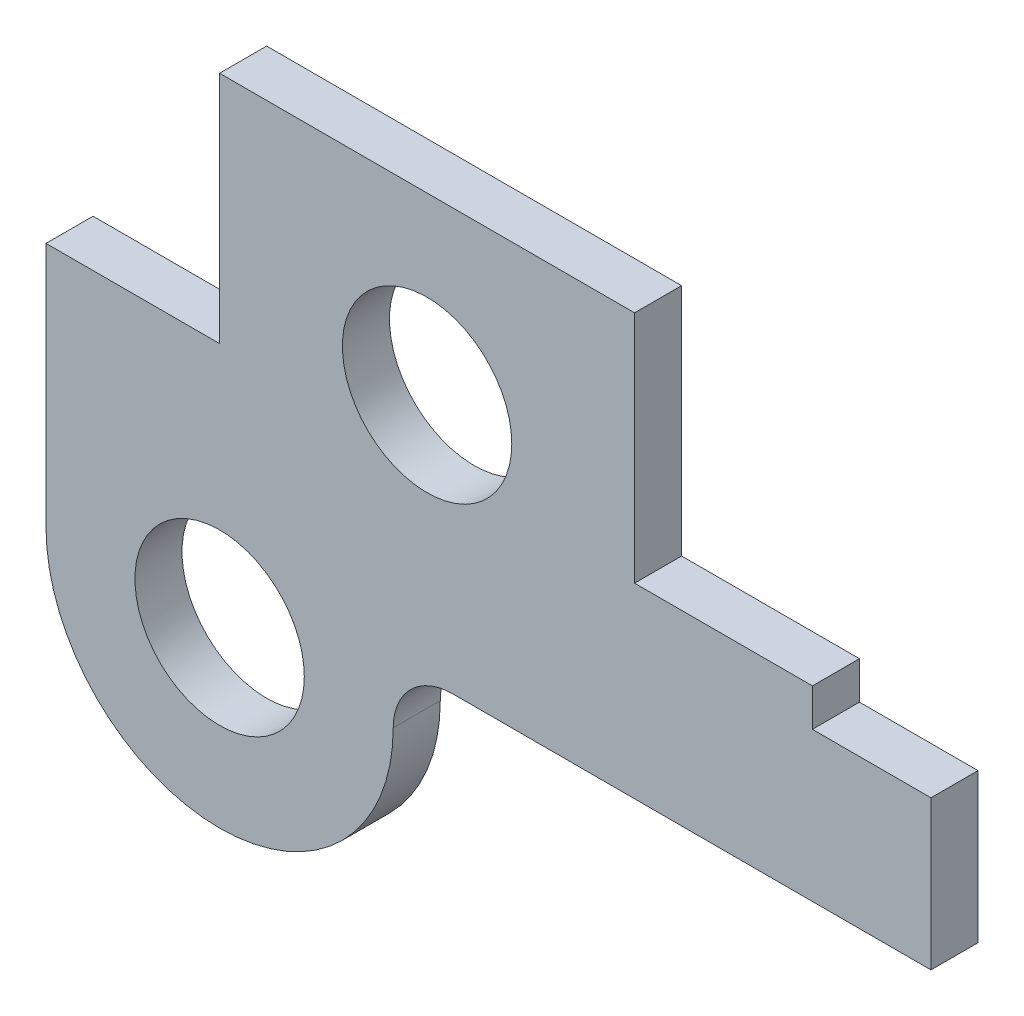
ISO-10303-21;
HEADER;
FILE_DESCRIPTION(('STEP AP214'),'2;1');
FILE_NAME('part.step','',(''),(''),'','','');
FILE_SCHEMA(('AUTOMOTIVE_DESIGN { 1 0 10303 214 1 1 1 1 }'));
ENDSEC;
DATA;
#1=APPLICATION_CONTEXT('core data for automotive mechanical design processes');
#2=APPLICATION_PROTOCOL_DEFINITION('international standard','automotive_design',2000,#1);
#3=PRODUCT_CONTEXT('',#1,'mechanical');
#4=PRODUCT('Part','Part','',(#3));
#5=PRODUCT_RELATED_PRODUCT_CATEGORY('part','',(#4));
#6=PRODUCT_DEFINITION_FORMATION('','',#4);
#7=PRODUCT_DEFINITION_CONTEXT('part definition',#1,'design');
#8=PRODUCT_DEFINITION('design','',#6,#7);
#9=PRODUCT_DEFINITION_SHAPE('','',#8);
#10=(LENGTH_UNIT() NAMED_UNIT(*) SI_UNIT(.MILLI.,.METRE.));
#11=(NAMED_UNIT(*) PLANE_ANGLE_UNIT() SI_UNIT($,.RADIAN.));
#12=(NAMED_UNIT(*) SI_UNIT($,.STERADIAN.) SOLID_ANGLE_UNIT());
#13=UNCERTAINTY_MEASURE_WITH_UNIT(LENGTH_MEASURE(1.E-05),#10,'distance_accuracy_value','');
#14=(GEOMETRIC_REPRESENTATION_CONTEXT(3) GLOBAL_UNCERTAINTY_ASSIGNED_CONTEXT((#13)) GLOBAL_UNIT_ASSIGNED_CONTEXT((#10,
#11,#12)) REPRESENTATION_CONTEXT('',''));
#15=CARTESIAN_POINT('',(0.,0.,0.));
#16=DIRECTION('',(0.,0.,1.));
#17=DIRECTION('',(1.,0.,0.));
#18=AXIS2_PLACEMENT_3D('',#15,#16,#17);
#19=CARTESIAN_POINT('',(68.575,29.2875,7.9375));
#20=DIRECTION('',(0.,0.,1.));
#21=DIRECTION('',(1.,0.,0.));
#22=AXIS2_PLACEMENT_3D('',#19,#20,#21);
#23=PLANE('',#22);
#24=CARTESIAN_POINT('',(64.2875,80.7875,7.9375));
#25=DIRECTION('',(0.,0.,1.));
#26=DIRECTION('',(1.,0.,0.));
#27=AXIS2_PLACEMENT_3D('',#24,#25,#26);
#28=CIRCLE('',#27,14.2875);
#29=CARTESIAN_POINT('',(78.575,80.7875,7.9375));
#30=VERTEX_POINT('',#29);
#31=EDGE_CURVE('E158',#30,#30,#28,.T.);
#32=ORIENTED_EDGE('',*,*,#31,.F.);
#33=EDGE_LOOP('',(#32));
#34=FACE_BOUND('',#33,.T.);
#35=CARTESIAN_POINT('',(68.575,29.2875,7.9375));
#36=DIRECTION('',(0.,0.,-1.));
#37=DIRECTION('',(1.,0.,0.));
#38=AXIS2_PLACEMENT_3D('',#35,#36,#37);
#39=CIRCLE('',#38,10.);
#40=CARTESIAN_POINT('',(58.575,29.2875,7.9375));
#41=VERTEX_POINT('',#40);
#42=CARTESIAN_POINT('',(68.575,39.2875,7.9375));
#43=VERTEX_POINT('',#42);
#44=EDGE_CURVE('E177',#41,#43,#39,.T.);
#45=ORIENTED_EDGE('',*,*,#44,.T.);
#46=DIRECTION('',(1.,0.,0.));
#47=VECTOR('',#46,1.);
#48=CARTESIAN_POINT('',(68.575,39.2875,7.9375));
#49=LINE('',#48,#47);
#50=CARTESIAN_POINT('',(149.2875,39.2875,7.9375));
#51=VERTEX_POINT('',#50);
#52=EDGE_CURVE('E105',#43,#51,#49,.T.);
#53=ORIENTED_EDGE('',*,*,#52,.T.);
#54=DIRECTION('',(0.,1.,0.));
#55=VECTOR('',#54,1.);
#56=CARTESIAN_POINT('',(149.2875,39.2875,7.9375));
#57=LINE('',#56,#55);
#58=CARTESIAN_POINT('',(149.2875,64.4375,7.9375));
#59=VERTEX_POINT('',#58);
#60=EDGE_CURVE('E204',#51,#59,#57,.T.);
#61=ORIENTED_EDGE('',*,*,#60,.T.);
#62=DIRECTION('',(-1.,0.,0.));
#63=VECTOR('',#62,1.);
#64=CARTESIAN_POINT('',(149.2875,64.4375,7.9375));
#65=LINE('',#64,#63);
#66=CARTESIAN_POINT('',(129.2875,64.4375,7.9375));
#67=VERTEX_POINT('',#66);
#68=EDGE_CURVE('E223',#59,#67,#65,.T.);
#69=ORIENTED_EDGE('',*,*,#68,.T.);
#70=DIRECTION('',(0.,1.,0.));
#71=VECTOR('',#70,1.);
#72=CARTESIAN_POINT('',(129.2875,64.4375,7.9375));
#73=LINE('',#72,#71);
#74=CARTESIAN_POINT('',(129.2875,70.7875,7.9375));
#75=VERTEX_POINT('',#74);
#76=EDGE_CURVE('E220',#67,#75,#73,.T.);
#77=ORIENTED_EDGE('',*,*,#76,.T.);
#78=DIRECTION('',(-1.,0.,0.));
#79=VECTOR('',#78,1.);
#80=CARTESIAN_POINT('',(129.2875,70.7875,7.9375));
#81=LINE('',#80,#79);
#82=CARTESIAN_POINT('',(99.2875,70.7875,7.9375));
#83=VERTEX_POINT('',#82);
#84=EDGE_CURVE('E222',#75,#83,#81,.T.);
#85=ORIENTED_EDGE('',*,*,#84,.T.);
#86=DIRECTION('',(0.,1.,0.));
#87=VECTOR('',#86,1.);
#88=CARTESIAN_POINT('',(99.2875,70.7875,7.9375));
#89=LINE('',#88,#87);
#90=CARTESIAN_POINT('',(99.2875,110.2875,7.9375));
#91=VERTEX_POINT('',#90);
#92=EDGE_CURVE('E225',#83,#91,#89,.T.);
#93=ORIENTED_EDGE('',*,*,#92,.T.);
#94=DIRECTION('',(-1.,0.,0.));
#95=VECTOR('',#94,1.);
#96=CARTESIAN_POINT('',(99.2875,110.2875,7.9375));
#97=LINE('',#96,#95);
#98=CARTESIAN_POINT('',(29.2875,110.2875,7.9375));
#99=VERTEX_POINT('',#98);
#100=EDGE_CURVE('E231',#91,#99,#97,.T.);
#101=ORIENTED_EDGE('',*,*,#100,.T.);
#102=DIRECTION('',(0.,-1.,0.));
#103=VECTOR('',#102,1.);
#104=CARTESIAN_POINT('',(29.2875,70.7875,7.9375));
#105=LINE('',#104,#103);
#106=CARTESIAN_POINT('',(29.2875,70.7875,7.9375));
#107=VERTEX_POINT('',#106);
#108=EDGE_CURVE('E136',#99,#107,#105,.T.);
#109=ORIENTED_EDGE('',*,*,#108,.T.);
#110=DIRECTION('',(-1.,0.,0.));
#111=VECTOR('',#110,1.);
#112=CARTESIAN_POINT('',(0.,70.7875,7.9375));
#113=LINE('',#112,#111);
#114=CARTESIAN_POINT('',(0.,70.7875,7.9375));
#115=VERTEX_POINT('',#114);
#116=EDGE_CURVE('E130',#107,#115,#113,.T.);
#117=ORIENTED_EDGE('',*,*,#116,.T.);
#118=DIRECTION('',(0.,-1.,0.));
#119=VECTOR('',#118,1.);
#120=CARTESIAN_POINT('',(0.,29.2875,7.9375));
#121=LINE('',#120,#119);
#122=CARTESIAN_POINT('',(0.,29.2875,7.9375));
#123=VERTEX_POINT('',#122);
#124=EDGE_CURVE('E134',#115,#123,#121,.T.);
#125=ORIENTED_EDGE('',*,*,#124,.T.);
#126=CARTESIAN_POINT('',(29.2875,29.2875,7.9375));
#127=DIRECTION('',(0.,0.,1.));
#128=DIRECTION('',(1.,0.,0.));
#129=AXIS2_PLACEMENT_3D('',#126,#127,#128);
#130=CIRCLE('',#129,29.2875);
#131=EDGE_CURVE('E50',#123,#41,#130,.T.);
#132=ORIENTED_EDGE('',*,*,#131,.T.);
#133=EDGE_LOOP('',(#45,#53,#61,#69,#77,#85,#93,#101,#109,#117,#125,#132));
#134=FACE_BOUND('',#133,.T.);
#135=CARTESIAN_POINT('',(29.2875,29.2875,7.9375));
#136=DIRECTION('',(0.,0.,1.));
#137=DIRECTION('',(1.,0.,0.));
#138=AXIS2_PLACEMENT_3D('',#135,#136,#137);
#139=CIRCLE('',#138,14.2875);
#140=CARTESIAN_POINT('',(43.575,29.2875,7.9375));
#141=VERTEX_POINT('',#140);
#142=EDGE_CURVE('E273',#141,#141,#139,.T.);
#143=ORIENTED_EDGE('',*,*,#142,.F.);
#144=EDGE_LOOP('',(#143));
#145=FACE_BOUND('',#144,.T.);
#146=ADVANCED_FACE('F33',(#34,#134,#145),#23,.T.);
#147=CARTESIAN_POINT('',(68.575,29.2875,0.));
#148=DIRECTION('',(0.,0.,1.));
#149=DIRECTION('',(1.,0.,0.));
#150=AXIS2_PLACEMENT_3D('',#147,#148,#149);
#151=PLANE('',#150);
#152=CARTESIAN_POINT('',(68.575,29.2875,0.));
#153=DIRECTION('',(0.,0.,-1.));
#154=DIRECTION('',(1.,0.,0.));
#155=AXIS2_PLACEMENT_3D('',#152,#153,#154);
#156=CIRCLE('',#155,10.);
#157=CARTESIAN_POINT('',(58.575,29.2875,0.));
#158=VERTEX_POINT('',#157);
#159=CARTESIAN_POINT('',(68.575,39.2875,0.));
#160=VERTEX_POINT('',#159);
#161=EDGE_CURVE('E154',#158,#160,#156,.T.);
#162=ORIENTED_EDGE('',*,*,#161,.F.);
#163=CARTESIAN_POINT('',(29.2875,29.2875,0.));
#164=DIRECTION('',(0.,0.,1.));
#165=DIRECTION('',(1.,0.,0.));
#166=AXIS2_PLACEMENT_3D('',#163,#164,#165);
#167=CIRCLE('',#166,29.2875);
#168=CARTESIAN_POINT('',(0.,29.2875,0.));
#169=VERTEX_POINT('',#168);
#170=EDGE_CURVE('E97',#169,#158,#167,.T.);
#171=ORIENTED_EDGE('',*,*,#170,.F.);
#172=DIRECTION('',(0.,-1.,0.));
#173=VECTOR('',#172,1.);
#174=CARTESIAN_POINT('',(0.,29.2875,0.));
#175=LINE('',#174,#173);
#176=CARTESIAN_POINT('',(0.,70.7875,0.));
#177=VERTEX_POINT('',#176);
#178=EDGE_CURVE('E91',#177,#169,#175,.T.);
#179=ORIENTED_EDGE('',*,*,#178,.F.);
#180=DIRECTION('',(-1.,0.,0.));
#181=VECTOR('',#180,1.);
#182=CARTESIAN_POINT('',(0.,70.7875,0.));
#183=LINE('',#182,#181);
#184=CARTESIAN_POINT('',(29.2875,70.7875,0.));
#185=VERTEX_POINT('',#184);
#186=EDGE_CURVE('E144',#185,#177,#183,.T.);
#187=ORIENTED_EDGE('',*,*,#186,.F.);
#188=DIRECTION('',(0.,-1.,0.));
#189=VECTOR('',#188,1.);
#190=CARTESIAN_POINT('',(29.2875,70.7875,0.));
#191=LINE('',#190,#189);
#192=CARTESIAN_POINT('',(29.2875,110.2875,0.));
#193=VERTEX_POINT('',#192);
#194=EDGE_CURVE('E172',#193,#185,#191,.T.);
#195=ORIENTED_EDGE('',*,*,#194,.F.);
#196=DIRECTION('',(-1.,0.,0.));
#197=VECTOR('',#196,1.);
#198=CARTESIAN_POINT('',(99.2875,110.2875,0.));
#199=LINE('',#198,#197);
#200=CARTESIAN_POINT('',(99.2875,110.2875,0.));
#201=VERTEX_POINT('',#200);
#202=EDGE_CURVE('E170',#201,#193,#199,.T.);
#203=ORIENTED_EDGE('',*,*,#202,.F.);
#204=DIRECTION('',(0.,1.,0.));
#205=VECTOR('',#204,1.);
#206=CARTESIAN_POINT('',(99.2875,70.7875,0.));
#207=LINE('',#206,#205);
#208=CARTESIAN_POINT('',(99.2875,70.7875,0.));
#209=VERTEX_POINT('',#208);
#210=EDGE_CURVE('E168',#209,#201,#207,.T.);
#211=ORIENTED_EDGE('',*,*,#210,.F.);
#212=DIRECTION('',(-1.,0.,0.));
#213=VECTOR('',#212,1.);
#214=CARTESIAN_POINT('',(129.2875,70.7875,0.));
#215=LINE('',#214,#213);
#216=CARTESIAN_POINT('',(129.2875,70.7875,0.));
#217=VERTEX_POINT('',#216);
#218=EDGE_CURVE('E166',#217,#209,#215,.T.);
#219=ORIENTED_EDGE('',*,*,#218,.F.);
#220=DIRECTION('',(0.,1.,0.));
#221=VECTOR('',#220,1.);
#222=CARTESIAN_POINT('',(129.2875,64.4375,0.));
#223=LINE('',#222,#221);
#224=CARTESIAN_POINT('',(129.2875,64.4375,0.));
#225=VERTEX_POINT('',#224);
#226=EDGE_CURVE('E164',#225,#217,#223,.T.);
#227=ORIENTED_EDGE('',*,*,#226,.F.);
#228=DIRECTION('',(-1.,0.,0.));
#229=VECTOR('',#228,1.);
#230=CARTESIAN_POINT('',(149.2875,64.4375,0.));
#231=LINE('',#230,#229);
#232=CARTESIAN_POINT('',(149.2875,64.4375,0.));
#233=VERTEX_POINT('',#232);
#234=EDGE_CURVE('E162',#233,#225,#231,.T.);
#235=ORIENTED_EDGE('',*,*,#234,.F.);
#236=DIRECTION('',(0.,1.,0.));
#237=VECTOR('',#236,1.);
#238=CARTESIAN_POINT('',(149.2875,39.2875,0.));
#239=LINE('',#238,#237);
#240=CARTESIAN_POINT('',(149.2875,39.2875,0.));
#241=VERTEX_POINT('',#240);
#242=EDGE_CURVE('E160',#241,#233,#239,.T.);
#243=ORIENTED_EDGE('',*,*,#242,.F.);
#244=DIRECTION('',(1.,0.,0.));
#245=VECTOR('',#244,1.);
#246=CARTESIAN_POINT('',(68.575,39.2875,0.));
#247=LINE('',#246,#245);
#248=EDGE_CURVE('E157',#160,#241,#247,.T.);
#249=ORIENTED_EDGE('',*,*,#248,.F.);
#250=EDGE_LOOP('',(#162,#171,#179,#187,#195,#203,#211,#219,#227,#235,#243,#249));
#251=FACE_BOUND('',#250,.T.);
#252=CARTESIAN_POINT('',(64.2875,80.7875,0.));
#253=DIRECTION('',(0.,0.,1.));
#254=DIRECTION('',(1.,0.,0.));
#255=AXIS2_PLACEMENT_3D('',#252,#253,#254);
#256=CIRCLE('',#255,14.2875);
#257=CARTESIAN_POINT('',(78.575,80.7875,0.));
#258=VERTEX_POINT('',#257);
#259=EDGE_CURVE('E279',#258,#258,#256,.T.);
#260=ORIENTED_EDGE('',*,*,#259,.T.);
#261=EDGE_LOOP('',(#260));
#262=FACE_BOUND('',#261,.T.);
#263=CARTESIAN_POINT('',(29.2875,29.2875,0.));
#264=DIRECTION('',(0.,0.,1.));
#265=DIRECTION('',(1.,0.,0.));
#266=AXIS2_PLACEMENT_3D('',#263,#264,#265);
#267=CIRCLE('',#266,14.2875);
#268=CARTESIAN_POINT('',(43.575,29.2875,0.));
#269=VERTEX_POINT('',#268);
#270=EDGE_CURVE('E276',#269,#269,#267,.T.);
#271=ORIENTED_EDGE('',*,*,#270,.T.);
#272=EDGE_LOOP('',(#271));
#273=FACE_BOUND('',#272,.T.);
#274=ADVANCED_FACE('F208',(#251,#262,#273),#151,.F.);
#275=CARTESIAN_POINT('',(68.575,29.2875,7.9375));
#276=DIRECTION('',(0.,0.,-1.));
#277=DIRECTION('',(-1.,0.,0.));
#278=AXIS2_PLACEMENT_3D('',#275,#276,#277);
#279=CYLINDRICAL_SURFACE('',#278,10.);
#280=ORIENTED_EDGE('',*,*,#161,.T.);
#281=DIRECTION('',(0.,0.,-1.));
#282=VECTOR('',#281,1.);
#283=CARTESIAN_POINT('',(68.575,39.2875,7.9375));
#284=LINE('',#283,#282);
#285=EDGE_CURVE('E11',#43,#160,#284,.T.);
#286=ORIENTED_EDGE('',*,*,#285,.F.);
#287=ORIENTED_EDGE('',*,*,#44,.F.);
#288=DIRECTION('',(0.,0.,-1.));
#289=VECTOR('',#288,1.);
#290=CARTESIAN_POINT('',(58.575,29.2875,7.9375));
#291=LINE('',#290,#289);
#292=EDGE_CURVE('E150',#41,#158,#291,.T.);
#293=ORIENTED_EDGE('',*,*,#292,.T.);
#294=EDGE_LOOP('',(#280,#286,#287,#293));
#295=FACE_BOUND('',#294,.T.);
#296=ADVANCED_FACE('F35',(#295),#279,.F.);
#297=CARTESIAN_POINT('',(68.575,39.2875,7.9375));
#298=DIRECTION('',(0.,1.,0.));
#299=DIRECTION('',(0.,0.,1.));
#300=AXIS2_PLACEMENT_3D('',#297,#298,#299);
#301=PLANE('',#300);
#302=ORIENTED_EDGE('',*,*,#248,.T.);
#303=DIRECTION('',(0.,0.,-1.));
#304=VECTOR('',#303,1.);
#305=CARTESIAN_POINT('',(149.2875,39.2875,7.9375));
#306=LINE('',#305,#304);
#307=EDGE_CURVE('E42',#51,#241,#306,.T.);
#308=ORIENTED_EDGE('',*,*,#307,.F.);
#309=ORIENTED_EDGE('',*,*,#52,.F.);
#310=ORIENTED_EDGE('',*,*,#285,.T.);
#311=EDGE_LOOP('',(#302,#308,#309,#310));
#312=FACE_BOUND('',#311,.T.);
#313=ADVANCED_FACE('F372',(#312),#301,.F.);
#314=CARTESIAN_POINT('',(149.2875,39.2875,7.9375));
#315=DIRECTION('',(-1.,0.,0.));
#316=DIRECTION('',(0.,0.,1.));
#317=AXIS2_PLACEMENT_3D('',#314,#315,#316);
#318=PLANE('',#317);
#319=ORIENTED_EDGE('',*,*,#242,.T.);
#320=DIRECTION('',(0.,0.,-1.));
#321=VECTOR('',#320,1.);
#322=CARTESIAN_POINT('',(149.2875,64.4375,7.9375));
#323=LINE('',#322,#321);
#324=EDGE_CURVE('E196',#59,#233,#323,.T.);
#325=ORIENTED_EDGE('',*,*,#324,.F.);
#326=ORIENTED_EDGE('',*,*,#60,.F.);
#327=ORIENTED_EDGE('',*,*,#307,.T.);
#328=EDGE_LOOP('',(#319,#325,#326,#327));
#329=FACE_BOUND('',#328,.T.);
#330=ADVANCED_FACE('F202',(#329),#318,.F.);
#331=CARTESIAN_POINT('',(149.2875,64.4375,7.9375));
#332=DIRECTION('',(0.,-1.,0.));
#333=DIRECTION('',(1.,0.,0.));
#334=AXIS2_PLACEMENT_3D('',#331,#332,#333);
#335=PLANE('',#334);
#336=ORIENTED_EDGE('',*,*,#234,.T.);
#337=DIRECTION('',(0.,0.,-1.));
#338=VECTOR('',#337,1.);
#339=CARTESIAN_POINT('',(129.2875,64.4375,7.9375));
#340=LINE('',#339,#338);
#341=EDGE_CURVE('E193',#67,#225,#340,.T.);
#342=ORIENTED_EDGE('',*,*,#341,.F.);
#343=ORIENTED_EDGE('',*,*,#68,.F.);
#344=ORIENTED_EDGE('',*,*,#324,.T.);
#345=EDGE_LOOP('',(#336,#342,#343,#344));
#346=FACE_BOUND('',#345,.T.);
#347=ADVANCED_FACE('F214',(#346),#335,.F.);
#348=CARTESIAN_POINT('',(129.2875,64.4375,7.9375));
#349=DIRECTION('',(-1.,0.,0.));
#350=DIRECTION('',(0.,0.,1.));
#351=AXIS2_PLACEMENT_3D('',#348,#349,#350);
#352=PLANE('',#351);
#353=ORIENTED_EDGE('',*,*,#226,.T.);
#354=DIRECTION('',(0.,0.,-1.));
#355=VECTOR('',#354,1.);
#356=CARTESIAN_POINT('',(129.2875,70.7875,7.9375));
#357=LINE('',#356,#355);
#358=EDGE_CURVE('E190',#75,#217,#357,.T.);
#359=ORIENTED_EDGE('',*,*,#358,.F.);
#360=ORIENTED_EDGE('',*,*,#76,.F.);
#361=ORIENTED_EDGE('',*,*,#341,.T.);
#362=EDGE_LOOP('',(#353,#359,#360,#361));
#363=FACE_BOUND('',#362,.T.);
#364=ADVANCED_FACE('F218',(#363),#352,.F.);
#365=CARTESIAN_POINT('',(129.2875,70.7875,7.9375));
#366=DIRECTION('',(0.,-1.,0.));
#367=DIRECTION('',(0.,0.,-1.));
#368=AXIS2_PLACEMENT_3D('',#365,#366,#367);
#369=PLANE('',#368);
#370=ORIENTED_EDGE('',*,*,#218,.T.);
#371=DIRECTION('',(0.,0.,-1.));
#372=VECTOR('',#371,1.);
#373=CARTESIAN_POINT('',(99.2875,70.7875,7.9375));
#374=LINE('',#373,#372);
#375=EDGE_CURVE('E187',#83,#209,#374,.T.);
#376=ORIENTED_EDGE('',*,*,#375,.F.);
#377=ORIENTED_EDGE('',*,*,#84,.F.);
#378=ORIENTED_EDGE('',*,*,#358,.T.);
#379=EDGE_LOOP('',(#370,#376,#377,#378));
#380=FACE_BOUND('',#379,.T.);
#381=ADVANCED_FACE('F337',(#380),#369,.F.);
#382=CARTESIAN_POINT('',(99.2875,70.7875,7.9375));
#383=DIRECTION('',(-1.,0.,0.));
#384=DIRECTION('',(0.,0.,1.));
#385=AXIS2_PLACEMENT_3D('',#382,#383,#384);
#386=PLANE('',#385);
#387=ORIENTED_EDGE('',*,*,#210,.T.);
#388=DIRECTION('',(0.,0.,-1.));
#389=VECTOR('',#388,1.);
#390=CARTESIAN_POINT('',(99.2875,110.2875,7.9375));
#391=LINE('',#390,#389);
#392=EDGE_CURVE('E184',#91,#201,#391,.T.);
#393=ORIENTED_EDGE('',*,*,#392,.F.);
#394=ORIENTED_EDGE('',*,*,#92,.F.);
#395=ORIENTED_EDGE('',*,*,#375,.T.);
#396=EDGE_LOOP('',(#387,#393,#394,#395));
#397=FACE_BOUND('',#396,.T.);
#398=ADVANCED_FACE('F328',(#397),#386,.F.);
#399=CARTESIAN_POINT('',(99.2875,110.2875,7.9375));
#400=DIRECTION('',(0.,-1.,0.));
#401=DIRECTION('',(1.,0.,0.));
#402=AXIS2_PLACEMENT_3D('',#399,#400,#401);
#403=PLANE('',#402);
#404=ORIENTED_EDGE('',*,*,#202,.T.);
#405=DIRECTION('',(0.,0.,-1.));
#406=VECTOR('',#405,1.);
#407=CARTESIAN_POINT('',(29.2875,110.2875,7.9375));
#408=LINE('',#407,#406);
#409=EDGE_CURVE('E181',#99,#193,#408,.T.);
#410=ORIENTED_EDGE('',*,*,#409,.F.);
#411=ORIENTED_EDGE('',*,*,#100,.F.);
#412=ORIENTED_EDGE('',*,*,#392,.T.);
#413=EDGE_LOOP('',(#404,#410,#411,#412));
#414=FACE_BOUND('',#413,.T.);
#415=ADVANCED_FACE('F237',(#414),#403,.F.);
#416=CARTESIAN_POINT('',(29.2875,70.7875,7.9375));
#417=DIRECTION('',(1.,0.,0.));
#418=DIRECTION('',(0.,1.,0.));
#419=AXIS2_PLACEMENT_3D('',#416,#417,#418);
#420=PLANE('',#419);
#421=ORIENTED_EDGE('',*,*,#194,.T.);
#422=DIRECTION('',(0.,0.,-1.));
#423=VECTOR('',#422,1.);
#424=CARTESIAN_POINT('',(29.2875,70.7875,7.9375));
#425=LINE('',#424,#423);
#426=EDGE_CURVE('E145',#107,#185,#425,.T.);
#427=ORIENTED_EDGE('',*,*,#426,.F.);
#428=ORIENTED_EDGE('',*,*,#108,.F.);
#429=ORIENTED_EDGE('',*,*,#409,.T.);
#430=EDGE_LOOP('',(#421,#427,#428,#429));
#431=FACE_BOUND('',#430,.T.);
#432=ADVANCED_FACE('F241',(#431),#420,.F.);
#433=CARTESIAN_POINT('',(0.,70.7875,7.9375));
#434=DIRECTION('',(0.,-1.,0.));
#435=DIRECTION('',(0.,0.,-1.));
#436=AXIS2_PLACEMENT_3D('',#433,#434,#435);
#437=PLANE('',#436);
#438=ORIENTED_EDGE('',*,*,#186,.T.);
#439=DIRECTION('',(0.,0.,-1.));
#440=VECTOR('',#439,1.);
#441=CARTESIAN_POINT('',(0.,70.7875,7.9375));
#442=LINE('',#441,#440);
#443=EDGE_CURVE('E141',#115,#177,#442,.T.);
#444=ORIENTED_EDGE('',*,*,#443,.F.);
#445=ORIENTED_EDGE('',*,*,#116,.F.);
#446=ORIENTED_EDGE('',*,*,#426,.T.);
#447=EDGE_LOOP('',(#438,#444,#445,#446));
#448=FACE_BOUND('',#447,.T.);
#449=ADVANCED_FACE('F142',(#448),#437,.F.);
#450=CARTESIAN_POINT('',(0.,29.2875,7.9375));
#451=DIRECTION('',(1.,0.,0.));
#452=DIRECTION('',(0.,1.,0.));
#453=AXIS2_PLACEMENT_3D('',#450,#451,#452);
#454=PLANE('',#453);
#455=ORIENTED_EDGE('',*,*,#178,.T.);
#456=DIRECTION('',(0.,0.,-1.));
#457=VECTOR('',#456,1.);
#458=CARTESIAN_POINT('',(0.,29.2875,7.9375));
#459=LINE('',#458,#457);
#460=EDGE_CURVE('E146',#123,#169,#459,.T.);
#461=ORIENTED_EDGE('',*,*,#460,.F.);
#462=ORIENTED_EDGE('',*,*,#124,.F.);
#463=ORIENTED_EDGE('',*,*,#443,.T.);
#464=EDGE_LOOP('',(#455,#461,#462,#463));
#465=FACE_BOUND('',#464,.T.);
#466=ADVANCED_FACE('F148',(#465),#454,.F.);
#467=CARTESIAN_POINT('',(29.2875,29.2875,7.9375));
#468=DIRECTION('',(0.,0.,-1.));
#469=DIRECTION('',(-1.,0.,0.));
#470=AXIS2_PLACEMENT_3D('',#467,#468,#469);
#471=CYLINDRICAL_SURFACE('',#470,29.2875);
#472=ORIENTED_EDGE('',*,*,#170,.T.);
#473=ORIENTED_EDGE('',*,*,#292,.F.);
#474=ORIENTED_EDGE('',*,*,#131,.F.);
#475=ORIENTED_EDGE('',*,*,#460,.T.);
#476=EDGE_LOOP('',(#472,#473,#474,#475));
#477=FACE_BOUND('',#476,.T.);
#478=ADVANCED_FACE('F245',(#477),#471,.T.);
#479=CARTESIAN_POINT('',(64.2875,80.7875,7.9375));
#480=DIRECTION('',(0.,0.,-1.));
#481=DIRECTION('',(-1.,0.,0.));
#482=AXIS2_PLACEMENT_3D('',#479,#480,#481);
#483=CYLINDRICAL_SURFACE('',#482,14.2875);
#484=ORIENTED_EDGE('',*,*,#31,.T.);
#485=EDGE_LOOP('',(#484));
#486=FACE_BOUND('',#485,.T.);
#487=ORIENTED_EDGE('',*,*,#259,.F.);
#488=EDGE_LOOP('',(#487));
#489=FACE_BOUND('',#488,.T.);
#490=ADVANCED_FACE('F247',(#486,#489),#483,.F.);
#491=CARTESIAN_POINT('',(29.2875,29.2875,7.9375));
#492=DIRECTION('',(0.,0.,-1.));
#493=DIRECTION('',(-1.,0.,0.));
#494=AXIS2_PLACEMENT_3D('',#491,#492,#493);
#495=CYLINDRICAL_SURFACE('',#494,14.2875);
#496=ORIENTED_EDGE('',*,*,#142,.T.);
#497=EDGE_LOOP('',(#496));
#498=FACE_BOUND('',#497,.T.);
#499=ORIENTED_EDGE('',*,*,#270,.F.);
#500=EDGE_LOOP('',(#499));
#501=FACE_BOUND('',#500,.T.);
#502=ADVANCED_FACE('F253',(#498,#501),#495,.F.);
#503=CLOSED_SHELL('',(#146,#274,#296,#313,#330,#347,#364,#381,#398,#415,#432,#449,#466,#478,
#490,#502));
#504=MANIFOLD_SOLID_BREP('B2',#503);
#505=ADVANCED_BREP_SHAPE_REPRESENTATION('',(#18,#504),#14);
#506=SHAPE_DEFINITION_REPRESENTATION(#9,#505);
ENDSEC;
END-ISO-10303-21;
